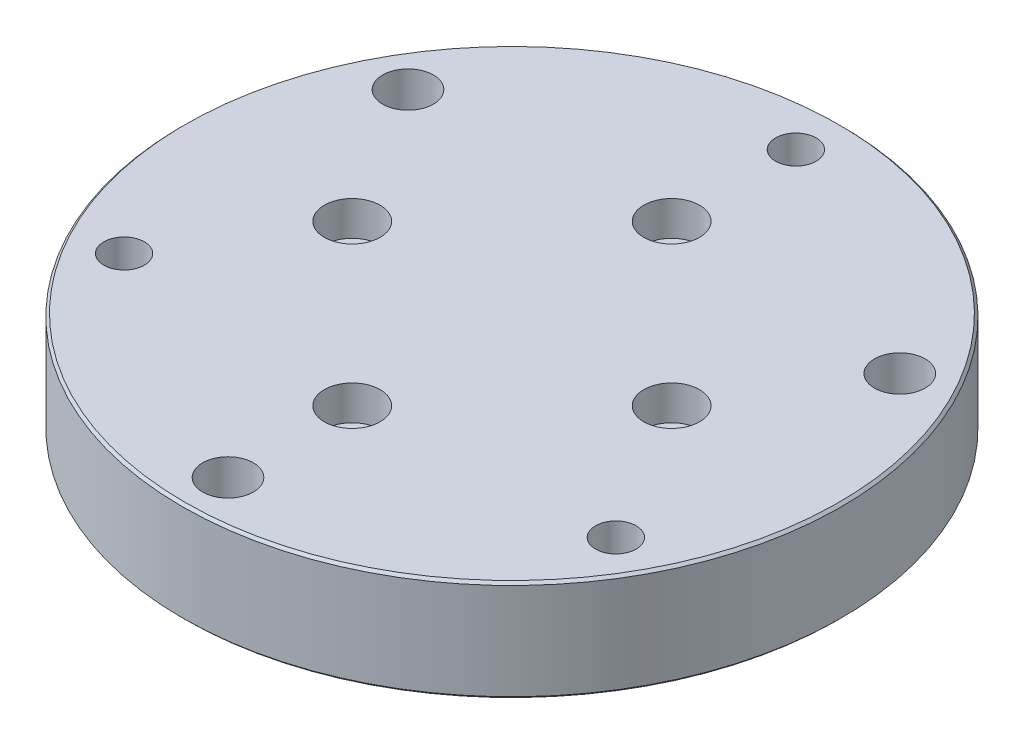
ISO-10303-21;
HEADER;
FILE_DESCRIPTION(('STEP AP214'),'2;1');
FILE_NAME('part.step','',(''),(''),'','','');
FILE_SCHEMA(('AUTOMOTIVE_DESIGN { 1 0 10303 214 1 1 1 1 }'));
ENDSEC;
DATA;
#1=APPLICATION_CONTEXT('core data for automotive mechanical design processes');
#2=APPLICATION_PROTOCOL_DEFINITION('international standard','automotive_design',2000,#1);
#3=PRODUCT_CONTEXT('',#1,'mechanical');
#4=PRODUCT('Part','Part','',(#3));
#5=PRODUCT_RELATED_PRODUCT_CATEGORY('part','',(#4));
#6=PRODUCT_DEFINITION_FORMATION('','',#4);
#7=PRODUCT_DEFINITION_CONTEXT('part definition',#1,'design');
#8=PRODUCT_DEFINITION('design','',#6,#7);
#9=PRODUCT_DEFINITION_SHAPE('','',#8);
#10=(LENGTH_UNIT() NAMED_UNIT(*) SI_UNIT(.MILLI.,.METRE.));
#11=(NAMED_UNIT(*) PLANE_ANGLE_UNIT() SI_UNIT($,.RADIAN.));
#12=(NAMED_UNIT(*) SI_UNIT($,.STERADIAN.) SOLID_ANGLE_UNIT());
#13=UNCERTAINTY_MEASURE_WITH_UNIT(LENGTH_MEASURE(1.E-05),#10,'distance_accuracy_value','');
#14=(GEOMETRIC_REPRESENTATION_CONTEXT(3) GLOBAL_UNCERTAINTY_ASSIGNED_CONTEXT((#13)) GLOBAL_UNIT_ASSIGNED_CONTEXT((#10,
#11,#12)) REPRESENTATION_CONTEXT('',''));
#15=CARTESIAN_POINT('',(0.,0.,0.));
#16=DIRECTION('',(0.,0.,1.));
#17=DIRECTION('',(1.,0.,0.));
#18=AXIS2_PLACEMENT_3D('',#15,#16,#17);
#19=CARTESIAN_POINT('',(0.,0.,0.));
#20=DIRECTION('',(0.,1.,0.));
#21=DIRECTION('',(0.,0.,1.));
#22=AXIS2_PLACEMENT_3D('',#19,#20,#21);
#23=PLANE('',#22);
#24=CARTESIAN_POINT('',(0.,0.,0.));
#25=DIRECTION('',(0.,1.,0.));
#26=DIRECTION('',(0.,0.,1.));
#27=AXIS2_PLACEMENT_3D('',#24,#25,#26);
#28=CIRCLE('',#27,64.5);
#29=CARTESIAN_POINT('',(0.,0.,64.5));
#30=VERTEX_POINT('',#29);
#31=EDGE_CURVE('P0_E22',#30,#30,#28,.F.);
#32=ORIENTED_EDGE('',*,*,#31,.T.);
#33=EDGE_LOOP('',(#32));
#34=FACE_BOUND('',#33,.T.);
#35=CARTESIAN_POINT('',(8.04911692853239E-13,0.,56.));
#36=DIRECTION('',(0.,1.,0.));
#37=DIRECTION('',(0.,0.,1.));
#38=AXIS2_PLACEMENT_3D('',#35,#36,#37);
#39=CIRCLE('',#38,5.);
#40=CARTESIAN_POINT('',(8.04911692853239E-13,0.,61.));
#41=VERTEX_POINT('',#40);
#42=EDGE_CURVE('P0_E125',#41,#41,#39,.T.);
#43=ORIENTED_EDGE('',*,*,#42,.T.);
#44=EDGE_LOOP('',(#43));
#45=FACE_BOUND('',#44,.T.);
#46=CARTESIAN_POINT('',(-48.4974226119289,0.,-27.9999999999995));
#47=DIRECTION('',(0.,1.,0.));
#48=DIRECTION('',(0.,0.,1.));
#49=AXIS2_PLACEMENT_3D('',#46,#47,#48);
#50=CIRCLE('',#49,5.);
#51=CARTESIAN_POINT('',(-48.4974226119289,0.,-22.9999999999995));
#52=VERTEX_POINT('',#51);
#53=EDGE_CURVE('P0_E119',#52,#52,#50,.T.);
#54=ORIENTED_EDGE('',*,*,#53,.T.);
#55=EDGE_LOOP('',(#54));
#56=FACE_BOUND('',#55,.T.);
#57=CARTESIAN_POINT('',(48.4974226119288,0.,27.9999999999995));
#58=DIRECTION('',(0.,1.,0.));
#59=DIRECTION('',(0.,0.,1.));
#60=AXIS2_PLACEMENT_3D('',#57,#58,#59);
#61=CIRCLE('',#60,4.);
#62=CARTESIAN_POINT('',(48.4974226119288,0.,31.9999999999995));
#63=VERTEX_POINT('',#62);
#64=EDGE_CURVE('P0_E113',#63,#63,#61,.T.);
#65=ORIENTED_EDGE('',*,*,#64,.T.);
#66=EDGE_LOOP('',(#65));
#67=FACE_BOUND('',#66,.T.);
#68=CARTESIAN_POINT('',(-48.4974226119284,0.,28.));
#69=DIRECTION('',(0.,1.,0.));
#70=DIRECTION('',(0.,0.,1.));
#71=AXIS2_PLACEMENT_3D('',#68,#69,#70);
#72=CIRCLE('',#71,4.);
#73=CARTESIAN_POINT('',(-48.4974226119284,0.,32.));
#74=VERTEX_POINT('',#73);
#75=EDGE_CURVE('P0_E107',#74,#74,#72,.T.);
#76=ORIENTED_EDGE('',*,*,#75,.T.);
#77=EDGE_LOOP('',(#76));
#78=FACE_BOUND('',#77,.T.);
#79=CARTESIAN_POINT('',(48.4974226119284,0.,-28.));
#80=DIRECTION('',(0.,1.,0.));
#81=DIRECTION('',(0.,0.,1.));
#82=AXIS2_PLACEMENT_3D('',#79,#80,#81);
#83=CIRCLE('',#82,5.);
#84=CARTESIAN_POINT('',(48.4974226119284,0.,-23.));
#85=VERTEX_POINT('',#84);
#86=EDGE_CURVE('P0_E101',#85,#85,#83,.T.);
#87=ORIENTED_EDGE('',*,*,#86,.T.);
#88=EDGE_LOOP('',(#87));
#89=FACE_BOUND('',#88,.T.);
#90=CARTESIAN_POINT('',(0.,0.,-56.));
#91=DIRECTION('',(0.,1.,0.));
#92=DIRECTION('',(0.,0.,1.));
#93=AXIS2_PLACEMENT_3D('',#90,#91,#92);
#94=CIRCLE('',#93,4.);
#95=CARTESIAN_POINT('',(0.,0.,-52.));
#96=VERTEX_POINT('',#95);
#97=EDGE_CURVE('P0_E93',#96,#96,#94,.T.);
#98=ORIENTED_EDGE('',*,*,#97,.T.);
#99=EDGE_LOOP('',(#98));
#100=FACE_BOUND('',#99,.T.);
#101=CARTESIAN_POINT('',(22.2738636073763,0.,-22.2738636073762));
#102=DIRECTION('',(0.,-1.,0.));
#103=DIRECTION('',(0.,0.,-1.));
#104=AXIS2_PLACEMENT_3D('',#101,#102,#103);
#105=CIRCLE('',#104,3.);
#106=CARTESIAN_POINT('',(22.2738636073763,0.,-25.2738636073762));
#107=VERTEX_POINT('',#106);
#108=EDGE_CURVE('P0_E90',#107,#107,#105,.T.);
#109=ORIENTED_EDGE('',*,*,#108,.F.);
#110=EDGE_LOOP('',(#109));
#111=FACE_BOUND('',#110,.T.);
#112=CARTESIAN_POINT('',(-3.29944986520676E-13,0.,31.5));
#113=DIRECTION('',(0.,1.,0.));
#114=DIRECTION('',(0.,0.,1.));
#115=AXIS2_PLACEMENT_3D('',#112,#113,#114);
#116=CIRCLE('',#115,3.3);
#117=CARTESIAN_POINT('',(-3.29944986520676E-13,0.,34.8));
#118=VERTEX_POINT('',#117);
#119=EDGE_CURVE('P0_E77',#118,#118,#116,.T.);
#120=ORIENTED_EDGE('',*,*,#119,.T.);
#121=EDGE_LOOP('',(#120));
#122=FACE_BOUND('',#121,.T.);
#123=CARTESIAN_POINT('',(31.5,0.,0.));
#124=DIRECTION('',(0.,1.,0.));
#125=DIRECTION('',(0.,0.,1.));
#126=AXIS2_PLACEMENT_3D('',#123,#124,#125);
#127=CIRCLE('',#126,3.3);
#128=CARTESIAN_POINT('',(31.5,0.,3.3));
#129=VERTEX_POINT('',#128);
#130=EDGE_CURVE('P0_E65',#129,#129,#127,.T.);
#131=ORIENTED_EDGE('',*,*,#130,.T.);
#132=EDGE_LOOP('',(#131));
#133=FACE_BOUND('',#132,.T.);
#134=CARTESIAN_POINT('',(1.09981662173559E-13,0.,-31.5));
#135=DIRECTION('',(0.,1.,0.));
#136=DIRECTION('',(0.,0.,1.));
#137=AXIS2_PLACEMENT_3D('',#134,#135,#136);
#138=CIRCLE('',#137,3.3);
#139=CARTESIAN_POINT('',(1.09981662173559E-13,0.,-28.2));
#140=VERTEX_POINT('',#139);
#141=EDGE_CURVE('P0_E53',#140,#140,#138,.T.);
#142=ORIENTED_EDGE('',*,*,#141,.T.);
#143=EDGE_LOOP('',(#142));
#144=FACE_BOUND('',#143,.T.);
#145=CARTESIAN_POINT('',(-31.5,0.,0.));
#146=DIRECTION('',(0.,1.,0.));
#147=DIRECTION('',(0.,0.,1.));
#148=AXIS2_PLACEMENT_3D('',#145,#146,#147);
#149=CIRCLE('',#148,3.3);
#150=CARTESIAN_POINT('',(-31.5,0.,3.3));
#151=VERTEX_POINT('',#150);
#152=EDGE_CURVE('P0_E41',#151,#151,#149,.T.);
#153=ORIENTED_EDGE('',*,*,#152,.T.);
#154=EDGE_LOOP('',(#153));
#155=FACE_BOUND('',#154,.T.);
#156=CARTESIAN_POINT('',(0.,0.,0.));
#157=DIRECTION('',(0.,1.,0.));
#158=DIRECTION('',(0.,0.,1.));
#159=AXIS2_PLACEMENT_3D('',#156,#157,#158);
#160=CIRCLE('',#159,25.5);
#161=CARTESIAN_POINT('',(0.,0.,25.5));
#162=VERTEX_POINT('',#161);
#163=EDGE_CURVE('P0_E35',#162,#162,#160,.T.);
#164=ORIENTED_EDGE('',*,*,#163,.T.);
#165=EDGE_LOOP('',(#164));
#166=FACE_BOUND('',#165,.T.);
#167=ADVANCED_FACE('P0_F15',(#34,#45,#56,#67,#78,#89,#100,#111,#122,#133,#144,#155,#166),#23,.F.);
#168=CARTESIAN_POINT('',(0.,20.,0.));
#169=DIRECTION('',(0.,-1.,0.));
#170=DIRECTION('',(0.,0.,-1.));
#171=AXIS2_PLACEMENT_3D('',#168,#169,#170);
#172=CYLINDRICAL_SURFACE('',#171,65.);
#173=CARTESIAN_POINT('',(0.,0.5,0.));
#174=DIRECTION('',(0.,1.,0.));
#175=DIRECTION('',(0.,0.,1.));
#176=AXIS2_PLACEMENT_3D('',#173,#174,#175);
#177=CIRCLE('',#176,65.);
#178=CARTESIAN_POINT('',(0.,0.5,65.));
#179=VERTEX_POINT('',#178);
#180=EDGE_CURVE('P0_E26',#179,#179,#177,.T.);
#181=ORIENTED_EDGE('',*,*,#180,.T.);
#182=EDGE_LOOP('',(#181));
#183=FACE_BOUND('',#182,.T.);
#184=CARTESIAN_POINT('',(0.,19.5,0.));
#185=DIRECTION('',(0.,1.,0.));
#186=DIRECTION('',(0.,0.,1.));
#187=AXIS2_PLACEMENT_3D('',#184,#185,#186);
#188=CIRCLE('',#187,65.);
#189=CARTESIAN_POINT('',(0.,19.5,65.));
#190=VERTEX_POINT('',#189);
#191=EDGE_CURVE('P0_E30',#190,#190,#188,.F.);
#192=ORIENTED_EDGE('',*,*,#191,.T.);
#193=EDGE_LOOP('',(#192));
#194=FACE_BOUND('',#193,.T.);
#195=ADVANCED_FACE('P0_F138',(#183,#194),#172,.T.);
#196=CARTESIAN_POINT('',(0.,20.,0.));
#197=DIRECTION('',(0.,1.,0.));
#198=DIRECTION('',(0.,0.,1.));
#199=AXIS2_PLACEMENT_3D('',#196,#197,#198);
#200=PLANE('',#199);
#201=CARTESIAN_POINT('',(0.,20.,0.));
#202=DIRECTION('',(0.,1.,0.));
#203=DIRECTION('',(0.,0.,1.));
#204=AXIS2_PLACEMENT_3D('',#201,#202,#203);
#205=CIRCLE('',#204,64.5);
#206=CARTESIAN_POINT('',(0.,20.,64.5));
#207=VERTEX_POINT('',#206);
#208=EDGE_CURVE('P0_E10',#207,#207,#205,.T.);
#209=ORIENTED_EDGE('',*,*,#208,.T.);
#210=EDGE_LOOP('',(#209));
#211=FACE_BOUND('',#210,.T.);
#212=CARTESIAN_POINT('',(8.04911692853239E-13,20.,56.));
#213=DIRECTION('',(0.,1.,0.));
#214=DIRECTION('',(0.,0.,1.));
#215=AXIS2_PLACEMENT_3D('',#212,#213,#214);
#216=CIRCLE('',#215,5.);
#217=CARTESIAN_POINT('',(8.04911692853239E-13,20.,61.));
#218=VERTEX_POINT('',#217);
#219=EDGE_CURVE('P0_E128',#218,#218,#216,.T.);
#220=ORIENTED_EDGE('',*,*,#219,.F.);
#221=EDGE_LOOP('',(#220));
#222=FACE_BOUND('',#221,.T.);
#223=CARTESIAN_POINT('',(-48.4974226119289,20.,-27.9999999999995));
#224=DIRECTION('',(0.,1.,0.));
#225=DIRECTION('',(0.,0.,1.));
#226=AXIS2_PLACEMENT_3D('',#223,#224,#225);
#227=CIRCLE('',#226,5.);
#228=CARTESIAN_POINT('',(-48.4974226119289,20.,-22.9999999999995));
#229=VERTEX_POINT('',#228);
#230=EDGE_CURVE('P0_E122',#229,#229,#227,.T.);
#231=ORIENTED_EDGE('',*,*,#230,.F.);
#232=EDGE_LOOP('',(#231));
#233=FACE_BOUND('',#232,.T.);
#234=CARTESIAN_POINT('',(48.4974226119288,20.,27.9999999999995));
#235=DIRECTION('',(0.,1.,0.));
#236=DIRECTION('',(0.,0.,1.));
#237=AXIS2_PLACEMENT_3D('',#234,#235,#236);
#238=CIRCLE('',#237,4.);
#239=CARTESIAN_POINT('',(48.4974226119288,20.,31.9999999999995));
#240=VERTEX_POINT('',#239);
#241=EDGE_CURVE('P0_E116',#240,#240,#238,.T.);
#242=ORIENTED_EDGE('',*,*,#241,.F.);
#243=EDGE_LOOP('',(#242));
#244=FACE_BOUND('',#243,.T.);
#245=CARTESIAN_POINT('',(-48.4974226119284,20.,28.));
#246=DIRECTION('',(0.,1.,0.));
#247=DIRECTION('',(0.,0.,1.));
#248=AXIS2_PLACEMENT_3D('',#245,#246,#247);
#249=CIRCLE('',#248,4.);
#250=CARTESIAN_POINT('',(-48.4974226119284,20.,32.));
#251=VERTEX_POINT('',#250);
#252=EDGE_CURVE('P0_E110',#251,#251,#249,.T.);
#253=ORIENTED_EDGE('',*,*,#252,.F.);
#254=EDGE_LOOP('',(#253));
#255=FACE_BOUND('',#254,.T.);
#256=CARTESIAN_POINT('',(48.4974226119284,20.,-28.));
#257=DIRECTION('',(0.,1.,0.));
#258=DIRECTION('',(0.,0.,1.));
#259=AXIS2_PLACEMENT_3D('',#256,#257,#258);
#260=CIRCLE('',#259,5.);
#261=CARTESIAN_POINT('',(48.4974226119284,20.,-23.));
#262=VERTEX_POINT('',#261);
#263=EDGE_CURVE('P0_E104',#262,#262,#260,.T.);
#264=ORIENTED_EDGE('',*,*,#263,.F.);
#265=EDGE_LOOP('',(#264));
#266=FACE_BOUND('',#265,.T.);
#267=CARTESIAN_POINT('',(0.,20.,-56.));
#268=DIRECTION('',(0.,1.,0.));
#269=DIRECTION('',(0.,0.,1.));
#270=AXIS2_PLACEMENT_3D('',#267,#268,#269);
#271=CIRCLE('',#270,4.);
#272=CARTESIAN_POINT('',(0.,20.,-52.));
#273=VERTEX_POINT('',#272);
#274=EDGE_CURVE('P0_E98',#273,#273,#271,.T.);
#275=ORIENTED_EDGE('',*,*,#274,.F.);
#276=EDGE_LOOP('',(#275));
#277=FACE_BOUND('',#276,.T.);
#278=CARTESIAN_POINT('',(-3.29944986520676E-13,20.,31.5));
#279=DIRECTION('',(0.,1.,0.));
#280=DIRECTION('',(0.,0.,1.));
#281=AXIS2_PLACEMENT_3D('',#278,#279,#280);
#282=CIRCLE('',#281,5.5);
#283=CARTESIAN_POINT('',(-3.29944986520676E-13,20.,37.));
#284=VERTEX_POINT('',#283);
#285=EDGE_CURVE('P0_E86',#284,#284,#282,.T.);
#286=ORIENTED_EDGE('',*,*,#285,.F.);
#287=EDGE_LOOP('',(#286));
#288=FACE_BOUND('',#287,.T.);
#289=CARTESIAN_POINT('',(31.5,20.,0.));
#290=DIRECTION('',(0.,1.,0.));
#291=DIRECTION('',(0.,0.,1.));
#292=AXIS2_PLACEMENT_3D('',#289,#290,#291);
#293=CIRCLE('',#292,5.5);
#294=CARTESIAN_POINT('',(31.5,20.,5.5));
#295=VERTEX_POINT('',#294);
#296=EDGE_CURVE('P0_E74',#295,#295,#293,.T.);
#297=ORIENTED_EDGE('',*,*,#296,.F.);
#298=EDGE_LOOP('',(#297));
#299=FACE_BOUND('',#298,.T.);
#300=CARTESIAN_POINT('',(1.09981662173559E-13,20.,-31.5));
#301=DIRECTION('',(0.,1.,0.));
#302=DIRECTION('',(0.,0.,1.));
#303=AXIS2_PLACEMENT_3D('',#300,#301,#302);
#304=CIRCLE('',#303,5.5);
#305=CARTESIAN_POINT('',(1.09981662173559E-13,20.,-26.));
#306=VERTEX_POINT('',#305);
#307=EDGE_CURVE('P0_E62',#306,#306,#304,.T.);
#308=ORIENTED_EDGE('',*,*,#307,.F.);
#309=EDGE_LOOP('',(#308));
#310=FACE_BOUND('',#309,.T.);
#311=CARTESIAN_POINT('',(-31.5,20.,0.));
#312=DIRECTION('',(0.,1.,0.));
#313=DIRECTION('',(0.,0.,1.));
#314=AXIS2_PLACEMENT_3D('',#311,#312,#313);
#315=CIRCLE('',#314,5.5);
#316=CARTESIAN_POINT('',(-31.5,20.,5.5));
#317=VERTEX_POINT('',#316);
#318=EDGE_CURVE('P0_E50',#317,#317,#315,.T.);
#319=ORIENTED_EDGE('',*,*,#318,.F.);
#320=EDGE_LOOP('',(#319));
#321=FACE_BOUND('',#320,.T.);
#322=ADVANCED_FACE('P0_F134',(#211,#222,#233,#244,#255,#266,#277,#288,#299,#310,#321),#200,.T.);
#323=CARTESIAN_POINT('',(0.,0.5,0.));
#324=DIRECTION('',(0.,-1.,0.));
#325=DIRECTION('',(0.,0.,-1.));
#326=AXIS2_PLACEMENT_3D('',#323,#324,#325);
#327=PLANE('',#326);
#328=CARTESIAN_POINT('',(0.,0.5,0.));
#329=DIRECTION('',(0.,-1.,0.));
#330=DIRECTION('',(0.,0.,-1.));
#331=AXIS2_PLACEMENT_3D('',#328,#329,#330);
#332=CIRCLE('',#331,25.);
#333=CARTESIAN_POINT('',(0.,0.5,-25.));
#334=VERTEX_POINT('',#333);
#335=EDGE_CURVE('P0_E38',#334,#334,#332,.T.);
#336=ORIENTED_EDGE('',*,*,#335,.T.);
#337=EDGE_LOOP('',(#336));
#338=FACE_BOUND('',#337,.T.);
#339=ADVANCED_FACE('P0_F137',(#338),#327,.T.);
#340=CARTESIAN_POINT('',(0.,0.5,0.));
#341=DIRECTION('',(0.,-1.,0.));
#342=DIRECTION('',(0.,0.,-1.));
#343=AXIS2_PLACEMENT_3D('',#340,#341,#342);
#344=CONICAL_SURFACE('',#343,25.,0.785398163397445);
#345=ORIENTED_EDGE('',*,*,#163,.F.);
#346=EDGE_LOOP('',(#345));
#347=FACE_BOUND('',#346,.T.);
#348=ORIENTED_EDGE('',*,*,#335,.F.);
#349=EDGE_LOOP('',(#348));
#350=FACE_BOUND('',#349,.T.);
#351=ADVANCED_FACE('P0_F190',(#347,#350),#344,.F.);
#352=CARTESIAN_POINT('',(-31.5,20.,0.));
#353=DIRECTION('',(0.,1.,0.));
#354=DIRECTION('',(0.,0.,1.));
#355=AXIS2_PLACEMENT_3D('',#352,#353,#354);
#356=CYLINDRICAL_SURFACE('',#355,3.3);
#357=ORIENTED_EDGE('',*,*,#152,.F.);
#358=EDGE_LOOP('',(#357));
#359=FACE_BOUND('',#358,.T.);
#360=CARTESIAN_POINT('',(-31.5,13.2,0.));
#361=DIRECTION('',(0.,1.,0.));
#362=DIRECTION('',(0.,0.,1.));
#363=AXIS2_PLACEMENT_3D('',#360,#361,#362);
#364=CIRCLE('',#363,3.3);
#365=CARTESIAN_POINT('',(-31.5,13.2,3.3));
#366=VERTEX_POINT('',#365);
#367=EDGE_CURVE('P0_E44',#366,#366,#364,.T.);
#368=ORIENTED_EDGE('',*,*,#367,.T.);
#369=EDGE_LOOP('',(#368));
#370=FACE_BOUND('',#369,.T.);
#371=ADVANCED_FACE('P0_F173',(#359,#370),#356,.F.);
#372=CARTESIAN_POINT('',(-28.2,13.2,0.));
#373=DIRECTION('',(0.,-1.,0.));
#374=DIRECTION('',(0.,0.,-1.));
#375=AXIS2_PLACEMENT_3D('',#372,#373,#374);
#376=PLANE('',#375);
#377=ORIENTED_EDGE('',*,*,#367,.F.);
#378=EDGE_LOOP('',(#377));
#379=FACE_BOUND('',#378,.T.);
#380=CARTESIAN_POINT('',(-31.5,13.2,0.));
#381=DIRECTION('',(0.,1.,0.));
#382=DIRECTION('',(0.,0.,1.));
#383=AXIS2_PLACEMENT_3D('',#380,#381,#382);
#384=CIRCLE('',#383,5.5);
#385=CARTESIAN_POINT('',(-31.5,13.2,5.5));
#386=VERTEX_POINT('',#385);
#387=EDGE_CURVE('P0_E47',#386,#386,#384,.T.);
#388=ORIENTED_EDGE('',*,*,#387,.T.);
#389=EDGE_LOOP('',(#388));
#390=FACE_BOUND('',#389,.T.);
#391=ADVANCED_FACE('P0_F161',(#379,#390),#376,.F.);
#392=CARTESIAN_POINT('',(-31.5,20.,0.));
#393=DIRECTION('',(0.,1.,0.));
#394=DIRECTION('',(0.,0.,1.));
#395=AXIS2_PLACEMENT_3D('',#392,#393,#394);
#396=CYLINDRICAL_SURFACE('',#395,5.5);
#397=ORIENTED_EDGE('',*,*,#387,.F.);
#398=EDGE_LOOP('',(#397));
#399=FACE_BOUND('',#398,.T.);
#400=ORIENTED_EDGE('',*,*,#318,.T.);
#401=EDGE_LOOP('',(#400));
#402=FACE_BOUND('',#401,.T.);
#403=ADVANCED_FACE('P0_F158',(#399,#402),#396,.F.);
#404=CARTESIAN_POINT('',(1.09981662173559E-13,20.,-31.5));
#405=DIRECTION('',(0.,1.,0.));
#406=DIRECTION('',(0.,0.,1.));
#407=AXIS2_PLACEMENT_3D('',#404,#405,#406);
#408=CYLINDRICAL_SURFACE('',#407,3.3);
#409=ORIENTED_EDGE('',*,*,#141,.F.);
#410=EDGE_LOOP('',(#409));
#411=FACE_BOUND('',#410,.T.);
#412=CARTESIAN_POINT('',(1.09981662173559E-13,13.2,-31.5));
#413=DIRECTION('',(0.,1.,0.));
#414=DIRECTION('',(0.,0.,1.));
#415=AXIS2_PLACEMENT_3D('',#412,#413,#414);
#416=CIRCLE('',#415,3.3);
#417=CARTESIAN_POINT('',(1.09981662173559E-13,13.2,-28.2));
#418=VERTEX_POINT('',#417);
#419=EDGE_CURVE('P0_E56',#418,#418,#416,.T.);
#420=ORIENTED_EDGE('',*,*,#419,.T.);
#421=EDGE_LOOP('',(#420));
#422=FACE_BOUND('',#421,.T.);
#423=ADVANCED_FACE('P0_F160',(#411,#422),#408,.F.);
#424=CARTESIAN_POINT('',(3.30000000000011,13.2,-31.5));
#425=DIRECTION('',(0.,-1.,0.));
#426=DIRECTION('',(0.,0.,-1.));
#427=AXIS2_PLACEMENT_3D('',#424,#425,#426);
#428=PLANE('',#427);
#429=ORIENTED_EDGE('',*,*,#419,.F.);
#430=EDGE_LOOP('',(#429));
#431=FACE_BOUND('',#430,.T.);
#432=CARTESIAN_POINT('',(1.09981662173559E-13,13.2,-31.5));
#433=DIRECTION('',(0.,1.,0.));
#434=DIRECTION('',(0.,0.,1.));
#435=AXIS2_PLACEMENT_3D('',#432,#433,#434);
#436=CIRCLE('',#435,5.5);
#437=CARTESIAN_POINT('',(1.09981662173559E-13,13.2,-26.));
#438=VERTEX_POINT('',#437);
#439=EDGE_CURVE('P0_E59',#438,#438,#436,.T.);
#440=ORIENTED_EDGE('',*,*,#439,.T.);
#441=EDGE_LOOP('',(#440));
#442=FACE_BOUND('',#441,.T.);
#443=ADVANCED_FACE('P0_F170',(#431,#442),#428,.F.);
#444=CARTESIAN_POINT('',(1.09981662173559E-13,20.,-31.5));
#445=DIRECTION('',(0.,1.,0.));
#446=DIRECTION('',(0.,0.,1.));
#447=AXIS2_PLACEMENT_3D('',#444,#445,#446);
#448=CYLINDRICAL_SURFACE('',#447,5.5);
#449=ORIENTED_EDGE('',*,*,#439,.F.);
#450=EDGE_LOOP('',(#449));
#451=FACE_BOUND('',#450,.T.);
#452=ORIENTED_EDGE('',*,*,#307,.T.);
#453=EDGE_LOOP('',(#452));
#454=FACE_BOUND('',#453,.T.);
#455=ADVANCED_FACE('P0_F266',(#451,#454),#448,.F.);
#456=CARTESIAN_POINT('',(31.5,20.,0.));
#457=DIRECTION('',(0.,1.,0.));
#458=DIRECTION('',(0.,0.,1.));
#459=AXIS2_PLACEMENT_3D('',#456,#457,#458);
#460=CYLINDRICAL_SURFACE('',#459,3.3);
#461=ORIENTED_EDGE('',*,*,#130,.F.);
#462=EDGE_LOOP('',(#461));
#463=FACE_BOUND('',#462,.T.);
#464=CARTESIAN_POINT('',(31.5,13.2,0.));
#465=DIRECTION('',(0.,1.,0.));
#466=DIRECTION('',(0.,0.,1.));
#467=AXIS2_PLACEMENT_3D('',#464,#465,#466);
#468=CIRCLE('',#467,3.3);
#469=CARTESIAN_POINT('',(31.5,13.2,3.3));
#470=VERTEX_POINT('',#469);
#471=EDGE_CURVE('P0_E68',#470,#470,#468,.T.);
#472=ORIENTED_EDGE('',*,*,#471,.T.);
#473=EDGE_LOOP('',(#472));
#474=FACE_BOUND('',#473,.T.);
#475=ADVANCED_FACE('P0_F262',(#463,#474),#460,.F.);
#476=CARTESIAN_POINT('',(34.8,13.2,0.));
#477=DIRECTION('',(0.,-1.,0.));
#478=DIRECTION('',(0.,0.,-1.));
#479=AXIS2_PLACEMENT_3D('',#476,#477,#478);
#480=PLANE('',#479);
#481=ORIENTED_EDGE('',*,*,#471,.F.);
#482=EDGE_LOOP('',(#481));
#483=FACE_BOUND('',#482,.T.);
#484=CARTESIAN_POINT('',(31.5,13.2,0.));
#485=DIRECTION('',(0.,1.,0.));
#486=DIRECTION('',(0.,0.,1.));
#487=AXIS2_PLACEMENT_3D('',#484,#485,#486);
#488=CIRCLE('',#487,5.5);
#489=CARTESIAN_POINT('',(31.5,13.2,5.5));
#490=VERTEX_POINT('',#489);
#491=EDGE_CURVE('P0_E71',#490,#490,#488,.T.);
#492=ORIENTED_EDGE('',*,*,#491,.T.);
#493=EDGE_LOOP('',(#492));
#494=FACE_BOUND('',#493,.T.);
#495=ADVANCED_FACE('P0_F258',(#483,#494),#480,.F.);
#496=CARTESIAN_POINT('',(31.5,20.,0.));
#497=DIRECTION('',(0.,1.,0.));
#498=DIRECTION('',(0.,0.,1.));
#499=AXIS2_PLACEMENT_3D('',#496,#497,#498);
#500=CYLINDRICAL_SURFACE('',#499,5.5);
#501=ORIENTED_EDGE('',*,*,#491,.F.);
#502=EDGE_LOOP('',(#501));
#503=FACE_BOUND('',#502,.T.);
#504=ORIENTED_EDGE('',*,*,#296,.T.);
#505=EDGE_LOOP('',(#504));
#506=FACE_BOUND('',#505,.T.);
#507=ADVANCED_FACE('P0_F254',(#503,#506),#500,.F.);
#508=CARTESIAN_POINT('',(-3.29944986520676E-13,20.,31.5));
#509=DIRECTION('',(0.,1.,0.));
#510=DIRECTION('',(0.,0.,1.));
#511=AXIS2_PLACEMENT_3D('',#508,#509,#510);
#512=CYLINDRICAL_SURFACE('',#511,3.3);
#513=ORIENTED_EDGE('',*,*,#119,.F.);
#514=EDGE_LOOP('',(#513));
#515=FACE_BOUND('',#514,.T.);
#516=CARTESIAN_POINT('',(-3.29944986520676E-13,13.2,31.5));
#517=DIRECTION('',(0.,1.,0.));
#518=DIRECTION('',(0.,0.,1.));
#519=AXIS2_PLACEMENT_3D('',#516,#517,#518);
#520=CIRCLE('',#519,3.3);
#521=CARTESIAN_POINT('',(-3.29944986520676E-13,13.2,34.8));
#522=VERTEX_POINT('',#521);
#523=EDGE_CURVE('P0_E80',#522,#522,#520,.T.);
#524=ORIENTED_EDGE('',*,*,#523,.T.);
#525=EDGE_LOOP('',(#524));
#526=FACE_BOUND('',#525,.T.);
#527=ADVANCED_FACE('P0_F250',(#515,#526),#512,.F.);
#528=CARTESIAN_POINT('',(3.29999999999967,13.2,31.5));
#529=DIRECTION('',(0.,-1.,0.));
#530=DIRECTION('',(0.,0.,-1.));
#531=AXIS2_PLACEMENT_3D('',#528,#529,#530);
#532=PLANE('',#531);
#533=ORIENTED_EDGE('',*,*,#523,.F.);
#534=EDGE_LOOP('',(#533));
#535=FACE_BOUND('',#534,.T.);
#536=CARTESIAN_POINT('',(-3.29944986520676E-13,13.2,31.5));
#537=DIRECTION('',(0.,1.,0.));
#538=DIRECTION('',(0.,0.,1.));
#539=AXIS2_PLACEMENT_3D('',#536,#537,#538);
#540=CIRCLE('',#539,5.5);
#541=CARTESIAN_POINT('',(-3.29944986520676E-13,13.2,37.));
#542=VERTEX_POINT('',#541);
#543=EDGE_CURVE('P0_E83',#542,#542,#540,.T.);
#544=ORIENTED_EDGE('',*,*,#543,.T.);
#545=EDGE_LOOP('',(#544));
#546=FACE_BOUND('',#545,.T.);
#547=ADVANCED_FACE('P0_F246',(#535,#546),#532,.F.);
#548=CARTESIAN_POINT('',(-3.29944986520676E-13,20.,31.5));
#549=DIRECTION('',(0.,1.,0.));
#550=DIRECTION('',(0.,0.,1.));
#551=AXIS2_PLACEMENT_3D('',#548,#549,#550);
#552=CYLINDRICAL_SURFACE('',#551,5.5);
#553=ORIENTED_EDGE('',*,*,#543,.F.);
#554=EDGE_LOOP('',(#553));
#555=FACE_BOUND('',#554,.T.);
#556=ORIENTED_EDGE('',*,*,#285,.T.);
#557=EDGE_LOOP('',(#556));
#558=FACE_BOUND('',#557,.T.);
#559=ADVANCED_FACE('P0_F242',(#555,#558),#552,.F.);
#560=CARTESIAN_POINT('',(22.2738636073763,8.,-22.2738636073762));
#561=DIRECTION('',(0.,-1.,0.));
#562=DIRECTION('',(0.,0.,-1.));
#563=AXIS2_PLACEMENT_3D('',#560,#561,#562);
#564=CYLINDRICAL_SURFACE('',#563,3.);
#565=CARTESIAN_POINT('',(22.2738636073763,8.,-22.2738636073762));
#566=DIRECTION('',(0.,-1.,0.));
#567=DIRECTION('',(0.,0.,-1.));
#568=AXIS2_PLACEMENT_3D('',#565,#566,#567);
#569=CIRCLE('',#568,3.);
#570=CARTESIAN_POINT('',(22.2738636073763,8.,-25.2738636073762));
#571=VERTEX_POINT('',#570);
#572=EDGE_CURVE('P0_E89',#571,#571,#569,.T.);
#573=ORIENTED_EDGE('',*,*,#572,.F.);
#574=EDGE_LOOP('',(#573));
#575=FACE_BOUND('',#574,.T.);
#576=ORIENTED_EDGE('',*,*,#108,.T.);
#577=EDGE_LOOP('',(#576));
#578=FACE_BOUND('',#577,.T.);
#579=ADVANCED_FACE('P0_F238',(#575,#578),#564,.F.);
#580=CARTESIAN_POINT('',(22.2738636073763,8.,-22.2738636073762));
#581=DIRECTION('',(0.,-1.,0.));
#582=DIRECTION('',(0.,0.,-1.));
#583=AXIS2_PLACEMENT_3D('',#580,#581,#582);
#584=PLANE('',#583);
#585=ORIENTED_EDGE('',*,*,#572,.T.);
#586=EDGE_LOOP('',(#585));
#587=FACE_BOUND('',#586,.T.);
#588=ADVANCED_FACE('P0_F234',(#587),#584,.T.);
#589=CARTESIAN_POINT('',(0.,20.,-56.));
#590=DIRECTION('',(0.,1.,0.));
#591=DIRECTION('',(0.,0.,1.));
#592=AXIS2_PLACEMENT_3D('',#589,#590,#591);
#593=CYLINDRICAL_SURFACE('',#592,4.);
#594=ORIENTED_EDGE('',*,*,#97,.F.);
#595=EDGE_LOOP('',(#594));
#596=FACE_BOUND('',#595,.T.);
#597=ORIENTED_EDGE('',*,*,#274,.T.);
#598=EDGE_LOOP('',(#597));
#599=FACE_BOUND('',#598,.T.);
#600=ADVANCED_FACE('P0_F230',(#596,#599),#593,.F.);
#601=CARTESIAN_POINT('',(48.4974226119284,20.,-28.));
#602=DIRECTION('',(0.,1.,0.));
#603=DIRECTION('',(0.,0.,1.));
#604=AXIS2_PLACEMENT_3D('',#601,#602,#603);
#605=CYLINDRICAL_SURFACE('',#604,5.);
#606=ORIENTED_EDGE('',*,*,#86,.F.);
#607=EDGE_LOOP('',(#606));
#608=FACE_BOUND('',#607,.T.);
#609=ORIENTED_EDGE('',*,*,#263,.T.);
#610=EDGE_LOOP('',(#609));
#611=FACE_BOUND('',#610,.T.);
#612=ADVANCED_FACE('P0_F226',(#608,#611),#605,.F.);
#613=CARTESIAN_POINT('',(-48.4974226119284,20.,28.));
#614=DIRECTION('',(0.,1.,0.));
#615=DIRECTION('',(0.,0.,1.));
#616=AXIS2_PLACEMENT_3D('',#613,#614,#615);
#617=CYLINDRICAL_SURFACE('',#616,4.);
#618=ORIENTED_EDGE('',*,*,#75,.F.);
#619=EDGE_LOOP('',(#618));
#620=FACE_BOUND('',#619,.T.);
#621=ORIENTED_EDGE('',*,*,#252,.T.);
#622=EDGE_LOOP('',(#621));
#623=FACE_BOUND('',#622,.T.);
#624=ADVANCED_FACE('P0_F222',(#620,#623),#617,.F.);
#625=CARTESIAN_POINT('',(48.4974226119288,20.,27.9999999999995));
#626=DIRECTION('',(0.,1.,0.));
#627=DIRECTION('',(0.,0.,1.));
#628=AXIS2_PLACEMENT_3D('',#625,#626,#627);
#629=CYLINDRICAL_SURFACE('',#628,4.);
#630=ORIENTED_EDGE('',*,*,#64,.F.);
#631=EDGE_LOOP('',(#630));
#632=FACE_BOUND('',#631,.T.);
#633=ORIENTED_EDGE('',*,*,#241,.T.);
#634=EDGE_LOOP('',(#633));
#635=FACE_BOUND('',#634,.T.);
#636=ADVANCED_FACE('P0_F215',(#632,#635),#629,.F.);
#637=CARTESIAN_POINT('',(-48.4974226119289,20.,-27.9999999999995));
#638=DIRECTION('',(0.,1.,0.));
#639=DIRECTION('',(0.,0.,1.));
#640=AXIS2_PLACEMENT_3D('',#637,#638,#639);
#641=CYLINDRICAL_SURFACE('',#640,5.);
#642=ORIENTED_EDGE('',*,*,#53,.F.);
#643=EDGE_LOOP('',(#642));
#644=FACE_BOUND('',#643,.T.);
#645=ORIENTED_EDGE('',*,*,#230,.T.);
#646=EDGE_LOOP('',(#645));
#647=FACE_BOUND('',#646,.T.);
#648=ADVANCED_FACE('P0_F203',(#644,#647),#641,.F.);
#649=CARTESIAN_POINT('',(8.04911692853239E-13,20.,56.));
#650=DIRECTION('',(0.,1.,0.));
#651=DIRECTION('',(0.,0.,1.));
#652=AXIS2_PLACEMENT_3D('',#649,#650,#651);
#653=CYLINDRICAL_SURFACE('',#652,5.);
#654=ORIENTED_EDGE('',*,*,#42,.F.);
#655=EDGE_LOOP('',(#654));
#656=FACE_BOUND('',#655,.T.);
#657=ORIENTED_EDGE('',*,*,#219,.T.);
#658=EDGE_LOOP('',(#657));
#659=FACE_BOUND('',#658,.T.);
#660=ADVANCED_FACE('P0_F132',(#656,#659),#653,.F.);
#661=CARTESIAN_POINT('',(0.,0.5,0.));
#662=DIRECTION('',(0.,1.,0.));
#663=DIRECTION('',(0.,0.,1.));
#664=AXIS2_PLACEMENT_3D('',#661,#662,#663);
#665=CONICAL_SURFACE('',#664,65.,0.785398163397462);
#666=ORIENTED_EDGE('',*,*,#31,.F.);
#667=EDGE_LOOP('',(#666));
#668=FACE_BOUND('',#667,.T.);
#669=ORIENTED_EDGE('',*,*,#180,.F.);
#670=EDGE_LOOP('',(#669));
#671=FACE_BOUND('',#670,.T.);
#672=ADVANCED_FACE('P0_F194',(#668,#671),#665,.T.);
#673=CARTESIAN_POINT('',(0.,20.,0.));
#674=DIRECTION('',(0.,-1.,0.));
#675=DIRECTION('',(0.,0.,-1.));
#676=AXIS2_PLACEMENT_3D('',#673,#674,#675);
#677=CONICAL_SURFACE('',#676,64.5,0.785398163397421);
#678=ORIENTED_EDGE('',*,*,#191,.F.);
#679=EDGE_LOOP('',(#678));
#680=FACE_BOUND('',#679,.T.);
#681=ORIENTED_EDGE('',*,*,#208,.F.);
#682=EDGE_LOOP('',(#681));
#683=FACE_BOUND('',#682,.T.);
#684=ADVANCED_FACE('P0_F17',(#680,#683),#677,.T.);
#685=CLOSED_SHELL('',(#167,#195,#322,#339,#351,#371,#391,#403,#423,#443,#455,#475,#495,#507,
#527,#547,#559,#579,#588,#600,#612,#624,#636,#648,#660,#672,#684));
#686=MANIFOLD_SOLID_BREP('P0_B1',#685);
#687=CARTESIAN_POINT('',(0.,-5.,0.));
#688=DIRECTION('',(0.,-1.,0.));
#689=DIRECTION('',(0.,0.,-1.));
#690=AXIS2_PLACEMENT_3D('',#687,#688,#689);
#691=PLANE('',#690);
#692=CARTESIAN_POINT('',(0.,-5.,0.));
#693=DIRECTION('',(0.,-1.,0.));
#694=DIRECTION('',(0.,0.,-1.));
#695=AXIS2_PLACEMENT_3D('',#692,#693,#694);
#696=CIRCLE('',#695,19.);
#697=CARTESIAN_POINT('',(0.,-5.,-19.));
#698=VERTEX_POINT('',#697);
#699=EDGE_CURVE('P1_E23',#698,#698,#696,.T.);
#700=ORIENTED_EDGE('',*,*,#699,.T.);
#701=EDGE_LOOP('',(#700));
#702=FACE_BOUND('',#701,.T.);
#703=ADVANCED_FACE('P1_F15',(#702),#691,.T.);
#704=CARTESIAN_POINT('',(0.,-5.,0.));
#705=DIRECTION('',(0.,1.,0.));
#706=DIRECTION('',(0.,0.,1.));
#707=AXIS2_PLACEMENT_3D('',#704,#705,#706);
#708=CONICAL_SURFACE('',#707,19.,0.785398163397455);
#709=CARTESIAN_POINT('',(0.,-4.,0.));
#710=DIRECTION('',(0.,-1.,0.));
#711=DIRECTION('',(0.,0.,-1.));
#712=AXIS2_PLACEMENT_3D('',#709,#710,#711);
#713=CIRCLE('',#712,20.);
#714=CARTESIAN_POINT('',(0.,-4.,-20.));
#715=VERTEX_POINT('',#714);
#716=EDGE_CURVE('P1_E10',#715,#715,#713,.F.);
#717=ORIENTED_EDGE('',*,*,#716,.F.);
#718=EDGE_LOOP('',(#717));
#719=FACE_BOUND('',#718,.T.);
#720=ORIENTED_EDGE('',*,*,#699,.F.);
#721=EDGE_LOOP('',(#720));
#722=FACE_BOUND('',#721,.T.);
#723=ADVANCED_FACE('P1_F17',(#719,#722),#708,.T.);
#724=CARTESIAN_POINT('',(0.,-5.,0.));
#725=DIRECTION('',(0.,1.,0.));
#726=DIRECTION('',(0.,0.,1.));
#727=AXIS2_PLACEMENT_3D('',#724,#725,#726);
#728=CYLINDRICAL_SURFACE('',#727,20.);
#729=CARTESIAN_POINT('',(0.,-0.5,0.));
#730=DIRECTION('',(0.,-1.,0.));
#731=DIRECTION('',(0.,0.,-1.));
#732=AXIS2_PLACEMENT_3D('',#729,#730,#731);
#733=CIRCLE('',#732,20.);
#734=CARTESIAN_POINT('',(0.,-0.5,-20.));
#735=VERTEX_POINT('',#734);
#736=EDGE_CURVE('P1_E19',#735,#735,#733,.T.);
#737=ORIENTED_EDGE('',*,*,#736,.T.);
#738=EDGE_LOOP('',(#737));
#739=FACE_BOUND('',#738,.T.);
#740=ORIENTED_EDGE('',*,*,#716,.T.);
#741=EDGE_LOOP('',(#740));
#742=FACE_BOUND('',#741,.T.);
#743=ADVANCED_FACE('P1_F33',(#739,#742),#728,.T.);
#744=CARTESIAN_POINT('',(0.,-0.5,0.));
#745=DIRECTION('',(0.,-1.,0.));
#746=DIRECTION('',(0.,0.,-1.));
#747=AXIS2_PLACEMENT_3D('',#744,#745,#746);
#748=PLANE('',#747);
#749=ORIENTED_EDGE('',*,*,#736,.F.);
#750=EDGE_LOOP('',(#749));
#751=FACE_BOUND('',#750,.T.);
#752=ADVANCED_FACE('P1_F35',(#751),#748,.F.);
#753=CLOSED_SHELL('',(#703,#723,#743,#752));
#754=MANIFOLD_SOLID_BREP('P1_B1',#753);
#755=ADVANCED_BREP_SHAPE_REPRESENTATION('',(#18,#686,#754),#14);
#756=SHAPE_DEFINITION_REPRESENTATION(#9,#755);
ENDSEC;
END-ISO-10303-21;
